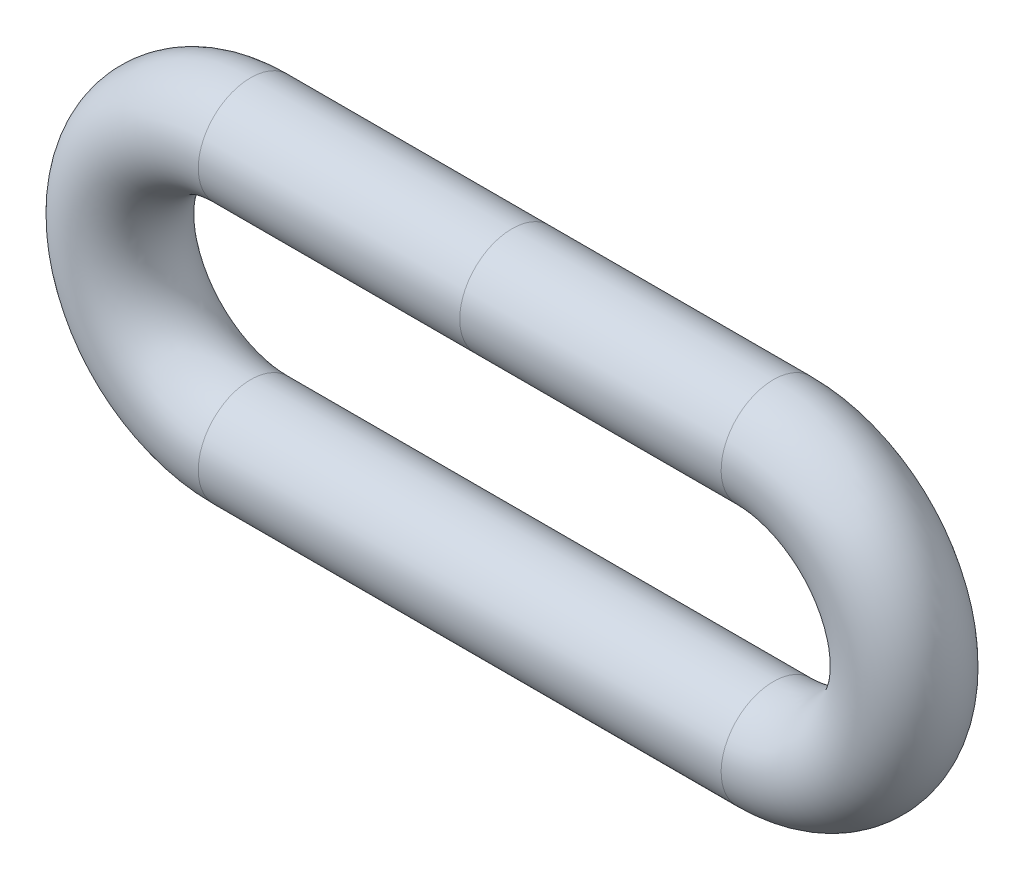
ISO-10303-21;
HEADER;
FILE_DESCRIPTION(('STEP AP214'),'2;1');
FILE_NAME('part.step','',(''),(''),'','','');
FILE_SCHEMA(('AUTOMOTIVE_DESIGN { 1 0 10303 214 1 1 1 1 }'));
ENDSEC;
DATA;
#1=APPLICATION_CONTEXT('core data for automotive mechanical design processes');
#2=APPLICATION_PROTOCOL_DEFINITION('international standard','automotive_design',2000,#1);
#3=PRODUCT_CONTEXT('',#1,'mechanical');
#4=PRODUCT('Part','Part','',(#3));
#5=PRODUCT_RELATED_PRODUCT_CATEGORY('part','',(#4));
#6=PRODUCT_DEFINITION_FORMATION('','',#4);
#7=PRODUCT_DEFINITION_CONTEXT('part definition',#1,'design');
#8=PRODUCT_DEFINITION('design','',#6,#7);
#9=PRODUCT_DEFINITION_SHAPE('','',#8);
#10=(LENGTH_UNIT() NAMED_UNIT(*) SI_UNIT(.MILLI.,.METRE.));
#11=(NAMED_UNIT(*) PLANE_ANGLE_UNIT() SI_UNIT($,.RADIAN.));
#12=(NAMED_UNIT(*) SI_UNIT($,.STERADIAN.) SOLID_ANGLE_UNIT());
#13=UNCERTAINTY_MEASURE_WITH_UNIT(LENGTH_MEASURE(1.E-05),#10,'distance_accuracy_value','');
#14=(GEOMETRIC_REPRESENTATION_CONTEXT(3) GLOBAL_UNCERTAINTY_ASSIGNED_CONTEXT((#13)) GLOBAL_UNIT_ASSIGNED_CONTEXT((#10,
#11,#12)) REPRESENTATION_CONTEXT('',''));
#15=CARTESIAN_POINT('',(0.,0.,0.));
#16=DIRECTION('',(0.,0.,1.));
#17=DIRECTION('',(1.,0.,0.));
#18=AXIS2_PLACEMENT_3D('',#15,#16,#17);
#19=CARTESIAN_POINT('',(0.,2.5,0.));
#20=DIRECTION('',(-1.,0.,0.));
#21=DIRECTION('',(0.,0.,1.));
#22=AXIS2_PLACEMENT_3D('',#19,#20,#21);
#23=CYLINDRICAL_SURFACE('',#22,1.);
#24=CARTESIAN_POINT('',(-5.,2.5,0.));
#25=DIRECTION('',(1.,0.,0.));
#26=DIRECTION('',(0.,0.,-1.));
#27=AXIS2_PLACEMENT_3D('',#24,#25,#26);
#28=CIRCLE('',#27,1.);
#29=CARTESIAN_POINT('',(-5.,3.5,0.));
#30=VERTEX_POINT('',#29);
#31=EDGE_CURVE('E61',#30,#30,#28,.T.);
#32=ORIENTED_EDGE('',*,*,#31,.T.);
#33=EDGE_LOOP('',(#32));
#34=FACE_BOUND('',#33,.T.);
#35=CARTESIAN_POINT('',(0.,2.5,0.));
#36=DIRECTION('',(1.,0.,0.));
#37=DIRECTION('',(0.,0.,-1.));
#38=AXIS2_PLACEMENT_3D('',#35,#36,#37);
#39=CIRCLE('',#38,1.);
#40=CARTESIAN_POINT('',(0.,2.5,-1.));
#41=VERTEX_POINT('',#40);
#42=EDGE_CURVE('E70',#41,#41,#39,.T.);
#43=ORIENTED_EDGE('',*,*,#42,.F.);
#44=EDGE_LOOP('',(#43));
#45=FACE_BOUND('',#44,.T.);
#46=ADVANCED_FACE('F43',(#34,#45),#23,.T.);
#47=CARTESIAN_POINT('',(-5.,0.,0.));
#48=DIRECTION('',(0.,0.,1.));
#49=DIRECTION('',(1.,0.,0.));
#50=AXIS2_PLACEMENT_3D('',#47,#48,#49);
#51=TOROIDAL_SURFACE('',#50,2.5,1.);
#52=CARTESIAN_POINT('',(-5.,-2.5,0.));
#53=DIRECTION('',(-1.,0.,0.));
#54=DIRECTION('',(0.,0.,-1.));
#55=AXIS2_PLACEMENT_3D('',#52,#53,#54);
#56=CIRCLE('',#55,1.);
#57=CARTESIAN_POINT('',(-5.,-3.5,0.));
#58=VERTEX_POINT('',#57);
#59=EDGE_CURVE('E57',#58,#58,#56,.T.);
#60=CARTESIAN_POINT('',(-5.,0.,0.));
#61=DIRECTION('',(0.,0.,1.));
#62=DIRECTION('',(1.,0.,0.));
#63=AXIS2_PLACEMENT_3D('',#60,#61,#62);
#64=CIRCLE('',#63,3.5);
#65=EDGE_CURVE('',#30,#58,#64,.T.);
#66=ORIENTED_EDGE('',*,*,#31,.F.);
#67=ORIENTED_EDGE('',*,*,#59,.T.);
#68=ORIENTED_EDGE('',*,*,#65,.T.);
#69=ORIENTED_EDGE('',*,*,#65,.F.);
#70=EDGE_LOOP('',(#66,#68,#67,#69));
#71=FACE_BOUND('',#70,.T.);
#72=ADVANCED_FACE('F75',(#71),#51,.T.);
#73=CARTESIAN_POINT('',(-5.,-2.5,0.));
#74=DIRECTION('',(1.,0.,0.));
#75=DIRECTION('',(0.,0.,-1.));
#76=AXIS2_PLACEMENT_3D('',#73,#74,#75);
#77=CYLINDRICAL_SURFACE('',#76,1.);
#78=CARTESIAN_POINT('',(5.,-2.5,0.));
#79=DIRECTION('',(-1.,0.,0.));
#80=DIRECTION('',(0.,0.,-1.));
#81=AXIS2_PLACEMENT_3D('',#78,#79,#80);
#82=CIRCLE('',#81,1.);
#83=CARTESIAN_POINT('',(5.,-3.5,0.));
#84=VERTEX_POINT('',#83);
#85=EDGE_CURVE('E51',#84,#84,#82,.T.);
#86=ORIENTED_EDGE('',*,*,#85,.T.);
#87=EDGE_LOOP('',(#86));
#88=FACE_BOUND('',#87,.T.);
#89=ORIENTED_EDGE('',*,*,#59,.F.);
#90=EDGE_LOOP('',(#89));
#91=FACE_BOUND('',#90,.T.);
#92=ADVANCED_FACE('F83',(#88,#91),#77,.T.);
#93=CARTESIAN_POINT('',(5.,0.,0.));
#94=DIRECTION('',(0.,0.,1.));
#95=DIRECTION('',(1.,0.,0.));
#96=AXIS2_PLACEMENT_3D('',#93,#94,#95);
#97=TOROIDAL_SURFACE('',#96,2.5,1.);
#98=CARTESIAN_POINT('',(5.,2.5,0.));
#99=DIRECTION('',(1.,0.,0.));
#100=DIRECTION('',(0.,0.,-1.));
#101=AXIS2_PLACEMENT_3D('',#98,#99,#100);
#102=CIRCLE('',#101,1.);
#103=CARTESIAN_POINT('',(5.,3.5,0.));
#104=VERTEX_POINT('',#103);
#105=EDGE_CURVE('E10',#104,#104,#102,.T.);
#106=CARTESIAN_POINT('',(5.,0.,0.));
#107=DIRECTION('',(0.,0.,1.));
#108=DIRECTION('',(1.,0.,0.));
#109=AXIS2_PLACEMENT_3D('',#106,#107,#108);
#110=CIRCLE('',#109,3.5);
#111=EDGE_CURVE('',#84,#104,#110,.T.);
#112=ORIENTED_EDGE('',*,*,#85,.F.);
#113=ORIENTED_EDGE('',*,*,#105,.T.);
#114=ORIENTED_EDGE('',*,*,#111,.T.);
#115=ORIENTED_EDGE('',*,*,#111,.F.);
#116=EDGE_LOOP('',(#112,#114,#113,#115));
#117=FACE_BOUND('',#116,.T.);
#118=ADVANCED_FACE('F86',(#117),#97,.T.);
#119=CARTESIAN_POINT('',(5.,2.5,0.));
#120=DIRECTION('',(-1.,0.,0.));
#121=DIRECTION('',(0.,0.,1.));
#122=AXIS2_PLACEMENT_3D('',#119,#120,#121);
#123=CYLINDRICAL_SURFACE('',#122,1.);
#124=ORIENTED_EDGE('',*,*,#42,.T.);
#125=EDGE_LOOP('',(#124));
#126=FACE_BOUND('',#125,.T.);
#127=ORIENTED_EDGE('',*,*,#105,.F.);
#128=EDGE_LOOP('',(#127));
#129=FACE_BOUND('',#128,.T.);
#130=ADVANCED_FACE('F44',(#126,#129),#123,.T.);
#131=CLOSED_SHELL('',(#46,#72,#92,#118,#130));
#132=MANIFOLD_SOLID_BREP('B2',#131);
#133=ADVANCED_BREP_SHAPE_REPRESENTATION('',(#18,#132),#14);
#134=SHAPE_DEFINITION_REPRESENTATION(#9,#133);
ENDSEC;
END-ISO-10303-21;
